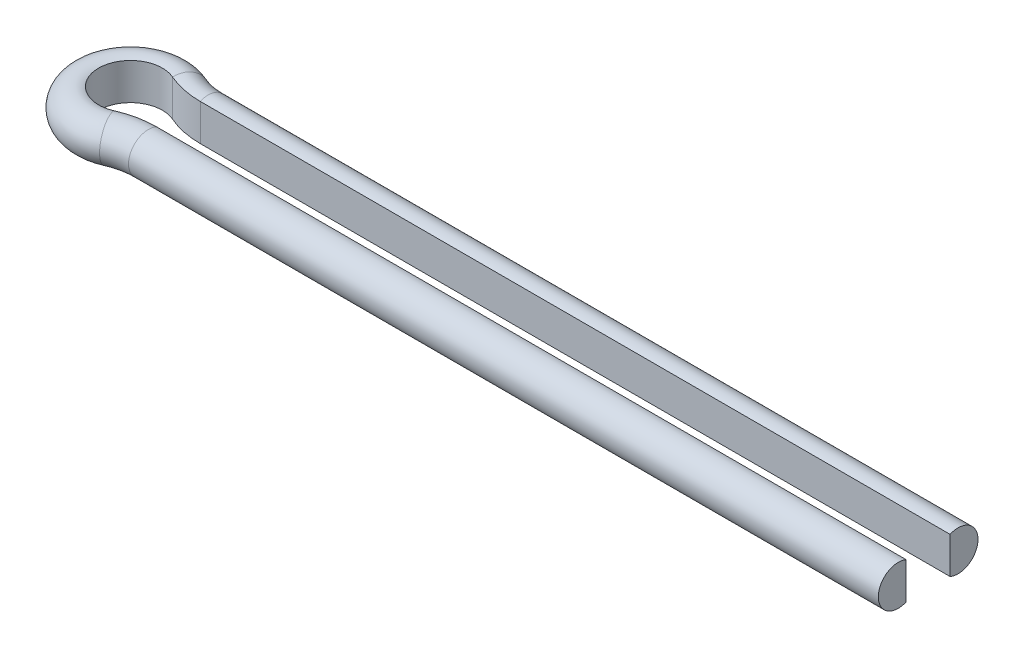
ISO-10303-21;
HEADER;
FILE_DESCRIPTION(('STEP AP214'),'2;1');
FILE_NAME('part.step','',(''),(''),'','','');
FILE_SCHEMA(('AUTOMOTIVE_DESIGN { 1 0 10303 214 1 1 1 1 }'));
ENDSEC;
DATA;
#1=APPLICATION_CONTEXT('core data for automotive mechanical design processes');
#2=APPLICATION_PROTOCOL_DEFINITION('international standard','automotive_design',2000,#1);
#3=PRODUCT_CONTEXT('',#1,'mechanical');
#4=PRODUCT('Part','Part','',(#3));
#5=PRODUCT_RELATED_PRODUCT_CATEGORY('part','',(#4));
#6=PRODUCT_DEFINITION_FORMATION('','',#4);
#7=PRODUCT_DEFINITION_CONTEXT('part definition',#1,'design');
#8=PRODUCT_DEFINITION('design','',#6,#7);
#9=PRODUCT_DEFINITION_SHAPE('','',#8);
#10=(LENGTH_UNIT() NAMED_UNIT(*) SI_UNIT(.MILLI.,.METRE.));
#11=(NAMED_UNIT(*) PLANE_ANGLE_UNIT() SI_UNIT($,.RADIAN.));
#12=(NAMED_UNIT(*) SI_UNIT($,.STERADIAN.) SOLID_ANGLE_UNIT());
#13=UNCERTAINTY_MEASURE_WITH_UNIT(LENGTH_MEASURE(1.E-05),#10,'distance_accuracy_value','');
#14=(GEOMETRIC_REPRESENTATION_CONTEXT(3) GLOBAL_UNCERTAINTY_ASSIGNED_CONTEXT((#13)) GLOBAL_UNIT_ASSIGNED_CONTEXT((#10,
#11,#12)) REPRESENTATION_CONTEXT('',''));
#15=CARTESIAN_POINT('',(0.,0.,0.));
#16=DIRECTION('',(0.,0.,1.));
#17=DIRECTION('',(1.,0.,0.));
#18=AXIS2_PLACEMENT_3D('',#15,#16,#17);
#19=CARTESIAN_POINT('',(0.,0.,0.));
#20=DIRECTION('',(1.,0.,0.));
#21=DIRECTION('',(0.,0.,-1.));
#22=AXIS2_PLACEMENT_3D('',#19,#20,#21);
#23=PLANE('',#22);
#24=CARTESIAN_POINT('',(0.,0.,0.));
#25=DIRECTION('',(1.,0.,0.));
#26=DIRECTION('',(0.,0.,-1.));
#27=AXIS2_PLACEMENT_3D('',#24,#25,#26);
#28=CIRCLE('',#27,2.5);
#29=CARTESIAN_POINT('',(0.,-2.29128784747792,1.));
#30=VERTEX_POINT('',#29);
#31=CARTESIAN_POINT('',(0.,2.29128784747792,1.));
#32=VERTEX_POINT('',#31);
#33=EDGE_CURVE('E86',#30,#32,#28,.T.);
#34=ORIENTED_EDGE('',*,*,#33,.T.);
#35=DIRECTION('',(0.,-1.,0.));
#36=VECTOR('',#35,1.);
#37=CARTESIAN_POINT('',(0.,2.29128784747792,1.));
#38=LINE('',#37,#36);
#39=EDGE_CURVE('E95',#32,#30,#38,.T.);
#40=ORIENTED_EDGE('',*,*,#39,.T.);
#41=EDGE_LOOP('',(#34,#40));
#42=FACE_BOUND('',#41,.T.);
#43=ADVANCED_FACE('F35',(#42),#23,.T.);
#44=CARTESIAN_POINT('',(0.,0.,7.50000000000001));
#45=DIRECTION('',(-1.,0.,0.));
#46=DIRECTION('',(0.,0.,1.));
#47=AXIS2_PLACEMENT_3D('',#44,#45,#46);
#48=PLANE('',#47);
#49=CARTESIAN_POINT('',(0.,0.,7.50000000000001));
#50=DIRECTION('',(-1.,0.,0.));
#51=DIRECTION('',(0.,0.,1.));
#52=AXIS2_PLACEMENT_3D('',#49,#50,#51);
#53=CIRCLE('',#52,2.5);
#54=CARTESIAN_POINT('',(0.,-2.29128784747792,6.50000000000001));
#55=VERTEX_POINT('',#54);
#56=CARTESIAN_POINT('',(0.,2.29128784747792,6.50000000000001));
#57=VERTEX_POINT('',#56);
#58=EDGE_CURVE('E49',#55,#57,#53,.T.);
#59=ORIENTED_EDGE('',*,*,#58,.F.);
#60=DIRECTION('',(0.,-1.,0.));
#61=VECTOR('',#60,1.);
#62=CARTESIAN_POINT('',(0.,2.29128784747792,6.50000000000001));
#63=LINE('',#62,#61);
#64=EDGE_CURVE('E11',#57,#55,#63,.T.);
#65=ORIENTED_EDGE('',*,*,#64,.F.);
#66=EDGE_LOOP('',(#59,#65));
#67=FACE_BOUND('',#66,.T.);
#68=ADVANCED_FACE('F186',(#67),#48,.F.);
#69=CARTESIAN_POINT('',(0.,0.,0.));
#70=DIRECTION('',(-1.,0.,0.));
#71=DIRECTION('',(0.,0.,1.));
#72=AXIS2_PLACEMENT_3D('',#69,#70,#71);
#73=CYLINDRICAL_SURFACE('',#72,2.5);
#74=DIRECTION('',(-1.,0.,0.));
#75=VECTOR('',#74,1.);
#76=CARTESIAN_POINT('',(0.,2.29128784747792,1.));
#77=LINE('',#76,#75);
#78=CARTESIAN_POINT('',(-94.0052105958591,2.29128784747792,1.00000000000001));
#79=VERTEX_POINT('',#78);
#80=EDGE_CURVE('E93',#32,#79,#77,.T.);
#81=ORIENTED_EDGE('',*,*,#80,.F.);
#82=ORIENTED_EDGE('',*,*,#33,.F.);
#83=DIRECTION('',(-1.,0.,0.));
#84=VECTOR('',#83,1.);
#85=CARTESIAN_POINT('',(0.,-2.29128784747792,1.));
#86=LINE('',#85,#84);
#87=CARTESIAN_POINT('',(-94.0052105958591,-2.29128784747792,1.00000000000001));
#88=VERTEX_POINT('',#87);
#89=EDGE_CURVE('E91',#30,#88,#86,.T.);
#90=ORIENTED_EDGE('',*,*,#89,.T.);
#91=CARTESIAN_POINT('',(-94.0052105958591,0.,0.));
#92=DIRECTION('',(1.,0.,0.));
#93=DIRECTION('',(0.,0.,-1.));
#94=AXIS2_PLACEMENT_3D('',#91,#92,#93);
#95=CIRCLE('',#94,2.5);
#96=EDGE_CURVE('E104',#88,#79,#95,.T.);
#97=ORIENTED_EDGE('',*,*,#96,.T.);
#98=EDGE_LOOP('',(#81,#82,#90,#97));
#99=FACE_BOUND('',#98,.T.);
#100=ADVANCED_FACE('F88',(#99),#73,.T.);
#101=CARTESIAN_POINT('',(0.,2.29128784747792,1.));
#102=DIRECTION('',(0.,0.,-1.));
#103=DIRECTION('',(-1.,0.,0.));
#104=AXIS2_PLACEMENT_3D('',#101,#102,#103);
#105=PLANE('',#104);
#106=DIRECTION('',(0.,-1.,0.));
#107=VECTOR('',#106,1.);
#108=CARTESIAN_POINT('',(-94.0052105958591,2.29128784747792,1.00000000000001));
#109=LINE('',#108,#107);
#110=EDGE_CURVE('E102',#79,#88,#109,.T.);
#111=ORIENTED_EDGE('',*,*,#110,.T.);
#112=ORIENTED_EDGE('',*,*,#89,.F.);
#113=ORIENTED_EDGE('',*,*,#39,.F.);
#114=ORIENTED_EDGE('',*,*,#80,.T.);
#115=EDGE_LOOP('',(#111,#112,#113,#114));
#116=FACE_BOUND('',#115,.T.);
#117=ADVANCED_FACE('F100',(#116),#105,.F.);
#118=CARTESIAN_POINT('',(-94.0052105958591,0.,-9.99999999999999));
#119=DIRECTION('',(0.,-1.,0.));
#120=DIRECTION('',(0.,0.,-1.));
#121=AXIS2_PLACEMENT_3D('',#118,#119,#120);
#122=TOROIDAL_SURFACE('',#121,10.,2.5);
#123=CARTESIAN_POINT('',(-94.0052105958591,2.29128784747792,-9.99999999999999));
#124=DIRECTION('',(0.,-1.,0.));
#125=DIRECTION('',(0.,0.,1.));
#126=AXIS2_PLACEMENT_3D('',#123,#124,#125);
#127=CIRCLE('',#126,11.);
#128=CARTESIAN_POINT('',(-98.4013894922291,2.29128784747792,0.083333333333345));
#129=VERTEX_POINT('',#128);
#130=EDGE_CURVE('E112',#79,#129,#127,.T.);
#131=ORIENTED_EDGE('',*,*,#130,.F.);
#132=ORIENTED_EDGE('',*,*,#96,.F.);
#133=CARTESIAN_POINT('',(-94.0052105958591,-2.29128784747792,-9.99999999999999));
#134=DIRECTION('',(0.,-1.,0.));
#135=DIRECTION('',(0.,0.,1.));
#136=AXIS2_PLACEMENT_3D('',#133,#134,#135);
#137=CIRCLE('',#136,11.);
#138=CARTESIAN_POINT('',(-98.4013894922291,-2.29128784747792,0.083333333333345));
#139=VERTEX_POINT('',#138);
#140=EDGE_CURVE('E113',#88,#139,#137,.T.);
#141=ORIENTED_EDGE('',*,*,#140,.T.);
#142=CARTESIAN_POINT('',(-98.0017368652864,0.,-0.833333333333323));
#143=DIRECTION('',(0.916666666666667,0.,0.399652626942727));
#144=DIRECTION('',(0.399652626942727,0.,-0.916666666666667));
#145=AXIS2_PLACEMENT_3D('',#142,#143,#144);
#146=CIRCLE('',#145,2.5);
#147=EDGE_CURVE('E109',#139,#129,#146,.T.);
#148=ORIENTED_EDGE('',*,*,#147,.T.);
#149=EDGE_LOOP('',(#131,#132,#141,#148));
#150=FACE_BOUND('',#149,.T.);
#151=ADVANCED_FACE('F166',(#150),#122,.T.);
#152=CARTESIAN_POINT('',(-94.0052105958591,0.,-9.99999999999999));
#153=DIRECTION('',(0.,-1.,0.));
#154=DIRECTION('',(0.,0.,-1.));
#155=AXIS2_PLACEMENT_3D('',#152,#153,#154);
#156=CYLINDRICAL_SURFACE('',#155,11.);
#157=DIRECTION('',(0.,-1.,0.));
#158=VECTOR('',#157,1.);
#159=CARTESIAN_POINT('',(-98.4013894922291,2.29128784747792,0.0833333333333435));
#160=LINE('',#159,#158);
#161=EDGE_CURVE('E116',#129,#139,#160,.T.);
#162=ORIENTED_EDGE('',*,*,#161,.T.);
#163=ORIENTED_EDGE('',*,*,#140,.F.);
#164=ORIENTED_EDGE('',*,*,#110,.F.);
#165=ORIENTED_EDGE('',*,*,#130,.T.);
#166=EDGE_LOOP('',(#162,#163,#164,#165));
#167=FACE_BOUND('',#166,.T.);
#168=ADVANCED_FACE('F164',(#167),#156,.T.);
#169=CARTESIAN_POINT('',(-100.,0.,3.75000000000001));
#170=DIRECTION('',(0.,1.,0.));
#171=DIRECTION('',(0.,0.,1.));
#172=AXIS2_PLACEMENT_3D('',#169,#170,#171);
#173=TOROIDAL_SURFACE('',#172,5.,2.5);
#174=CARTESIAN_POINT('',(-100.,2.29128784747792,3.75000000000001));
#175=DIRECTION('',(0.,1.,0.));
#176=DIRECTION('',(0.399652626942727,0.,-0.916666666666667));
#177=AXIS2_PLACEMENT_3D('',#174,#175,#176);
#178=CIRCLE('',#177,4.);
#179=CARTESIAN_POINT('',(-98.4013894922291,2.29128784747792,7.41666666666667));
#180=VERTEX_POINT('',#179);
#181=EDGE_CURVE('E122',#129,#180,#178,.T.);
#182=ORIENTED_EDGE('',*,*,#181,.F.);
#183=ORIENTED_EDGE('',*,*,#147,.F.);
#184=CARTESIAN_POINT('',(-100.,-2.29128784747792,3.75000000000001));
#185=DIRECTION('',(0.,1.,0.));
#186=DIRECTION('',(0.399652626942727,0.,-0.916666666666667));
#187=AXIS2_PLACEMENT_3D('',#184,#185,#186);
#188=CIRCLE('',#187,4.);
#189=CARTESIAN_POINT('',(-98.4013894922291,-2.29128784747792,7.41666666666667));
#190=VERTEX_POINT('',#189);
#191=EDGE_CURVE('E123',#139,#190,#188,.T.);
#192=ORIENTED_EDGE('',*,*,#191,.T.);
#193=CARTESIAN_POINT('',(-98.0017368652864,0.,8.33333333333334));
#194=DIRECTION('',(-0.916666666666667,0.,0.399652626942726));
#195=DIRECTION('',(0.399652626942726,0.,0.916666666666667));
#196=AXIS2_PLACEMENT_3D('',#193,#194,#195);
#197=CIRCLE('',#196,2.5);
#198=EDGE_CURVE('E119',#190,#180,#197,.T.);
#199=ORIENTED_EDGE('',*,*,#198,.T.);
#200=EDGE_LOOP('',(#182,#183,#192,#199));
#201=FACE_BOUND('',#200,.T.);
#202=ADVANCED_FACE('F159',(#201),#173,.T.);
#203=CARTESIAN_POINT('',(-100.,0.,3.75000000000001));
#204=DIRECTION('',(0.,1.,0.));
#205=DIRECTION('',(0.,0.,1.));
#206=AXIS2_PLACEMENT_3D('',#203,#204,#205);
#207=CYLINDRICAL_SURFACE('',#206,4.);
#208=DIRECTION('',(0.,-1.,0.));
#209=VECTOR('',#208,1.);
#210=CARTESIAN_POINT('',(-98.4013894922291,2.29128784747792,7.41666666666667));
#211=LINE('',#210,#209);
#212=EDGE_CURVE('E126',#180,#190,#211,.T.);
#213=ORIENTED_EDGE('',*,*,#212,.T.);
#214=ORIENTED_EDGE('',*,*,#191,.F.);
#215=ORIENTED_EDGE('',*,*,#161,.F.);
#216=ORIENTED_EDGE('',*,*,#181,.T.);
#217=EDGE_LOOP('',(#213,#214,#215,#216));
#218=FACE_BOUND('',#217,.T.);
#219=ADVANCED_FACE('F162',(#218),#207,.F.);
#220=CARTESIAN_POINT('',(-94.0052105958591,0.,17.5));
#221=DIRECTION('',(0.,-1.,0.));
#222=DIRECTION('',(0.,0.,-1.));
#223=AXIS2_PLACEMENT_3D('',#220,#221,#222);
#224=TOROIDAL_SURFACE('',#223,10.,2.5);
#225=CARTESIAN_POINT('',(-94.0052105958591,2.29128784747792,17.5));
#226=DIRECTION('',(0.,-1.,0.));
#227=DIRECTION('',(-0.399652626942727,0.,-0.916666666666667));
#228=AXIS2_PLACEMENT_3D('',#225,#226,#227);
#229=CIRCLE('',#228,11.);
#230=CARTESIAN_POINT('',(-94.0052105958591,2.29128784747792,6.50000000000001));
#231=VERTEX_POINT('',#230);
#232=EDGE_CURVE('E132',#180,#231,#229,.T.);
#233=ORIENTED_EDGE('',*,*,#232,.F.);
#234=ORIENTED_EDGE('',*,*,#198,.F.);
#235=CARTESIAN_POINT('',(-94.0052105958591,-2.29128784747792,17.5));
#236=DIRECTION('',(0.,-1.,0.));
#237=DIRECTION('',(-0.399652626942727,0.,-0.916666666666667));
#238=AXIS2_PLACEMENT_3D('',#235,#236,#237);
#239=CIRCLE('',#238,11.);
#240=CARTESIAN_POINT('',(-94.0052105958591,-2.29128784747792,6.50000000000001));
#241=VERTEX_POINT('',#240);
#242=EDGE_CURVE('E133',#190,#241,#239,.T.);
#243=ORIENTED_EDGE('',*,*,#242,.T.);
#244=CARTESIAN_POINT('',(-94.0052105958591,0.,7.50000000000001));
#245=DIRECTION('',(-1.,0.,0.));
#246=DIRECTION('',(0.,0.,1.));
#247=AXIS2_PLACEMENT_3D('',#244,#245,#246);
#248=CIRCLE('',#247,2.5);
#249=EDGE_CURVE('E129',#241,#231,#248,.T.);
#250=ORIENTED_EDGE('',*,*,#249,.T.);
#251=EDGE_LOOP('',(#233,#234,#243,#250));
#252=FACE_BOUND('',#251,.T.);
#253=ADVANCED_FACE('F156',(#252),#224,.T.);
#254=CARTESIAN_POINT('',(-94.0052105958591,0.,17.5));
#255=DIRECTION('',(0.,-1.,0.));
#256=DIRECTION('',(0.,0.,-1.));
#257=AXIS2_PLACEMENT_3D('',#254,#255,#256);
#258=CYLINDRICAL_SURFACE('',#257,11.);
#259=DIRECTION('',(0.,-1.,0.));
#260=VECTOR('',#259,1.);
#261=CARTESIAN_POINT('',(-94.0052105958591,2.29128784747792,6.50000000000001));
#262=LINE('',#261,#260);
#263=EDGE_CURVE('E136',#231,#241,#262,.T.);
#264=ORIENTED_EDGE('',*,*,#263,.T.);
#265=ORIENTED_EDGE('',*,*,#242,.F.);
#266=ORIENTED_EDGE('',*,*,#212,.F.);
#267=ORIENTED_EDGE('',*,*,#232,.T.);
#268=EDGE_LOOP('',(#264,#265,#266,#267));
#269=FACE_BOUND('',#268,.T.);
#270=ADVANCED_FACE('F151',(#269),#258,.T.);
#271=CARTESIAN_POINT('',(-94.0052105958591,0.,7.50000000000001));
#272=DIRECTION('',(1.,0.,0.));
#273=DIRECTION('',(0.,0.,-1.));
#274=AXIS2_PLACEMENT_3D('',#271,#272,#273);
#275=CYLINDRICAL_SURFACE('',#274,2.5);
#276=DIRECTION('',(1.,0.,0.));
#277=VECTOR('',#276,1.);
#278=CARTESIAN_POINT('',(-94.0052105958591,2.29128784747792,6.50000000000001));
#279=LINE('',#278,#277);
#280=EDGE_CURVE('E42',#231,#57,#279,.T.);
#281=ORIENTED_EDGE('',*,*,#280,.F.);
#282=ORIENTED_EDGE('',*,*,#249,.F.);
#283=DIRECTION('',(1.,0.,0.));
#284=VECTOR('',#283,1.);
#285=CARTESIAN_POINT('',(-94.0052105958591,-2.29128784747792,6.50000000000001));
#286=LINE('',#285,#284);
#287=EDGE_CURVE('E140',#241,#55,#286,.T.);
#288=ORIENTED_EDGE('',*,*,#287,.T.);
#289=ORIENTED_EDGE('',*,*,#58,.T.);
#290=EDGE_LOOP('',(#281,#282,#288,#289));
#291=FACE_BOUND('',#290,.T.);
#292=ADVANCED_FACE('F153',(#291),#275,.T.);
#293=CARTESIAN_POINT('',(-94.0052105958591,2.29128784747792,6.50000000000001));
#294=DIRECTION('',(0.,0.,1.));
#295=DIRECTION('',(1.,0.,0.));
#296=AXIS2_PLACEMENT_3D('',#293,#294,#295);
#297=PLANE('',#296);
#298=ORIENTED_EDGE('',*,*,#64,.T.);
#299=ORIENTED_EDGE('',*,*,#287,.F.);
#300=ORIENTED_EDGE('',*,*,#263,.F.);
#301=ORIENTED_EDGE('',*,*,#280,.T.);
#302=EDGE_LOOP('',(#298,#299,#300,#301));
#303=FACE_BOUND('',#302,.T.);
#304=ADVANCED_FACE('F177',(#303),#297,.F.);
#305=CLOSED_SHELL('',(#43,#68,#100,#117,#151,#168,#202,#219,#253,#270,#292,#304));
#306=MANIFOLD_SOLID_BREP('B2',#305);
#307=ADVANCED_BREP_SHAPE_REPRESENTATION('',(#18,#306),#14);
#308=SHAPE_DEFINITION_REPRESENTATION(#9,#307);
ENDSEC;
END-ISO-10303-21;
